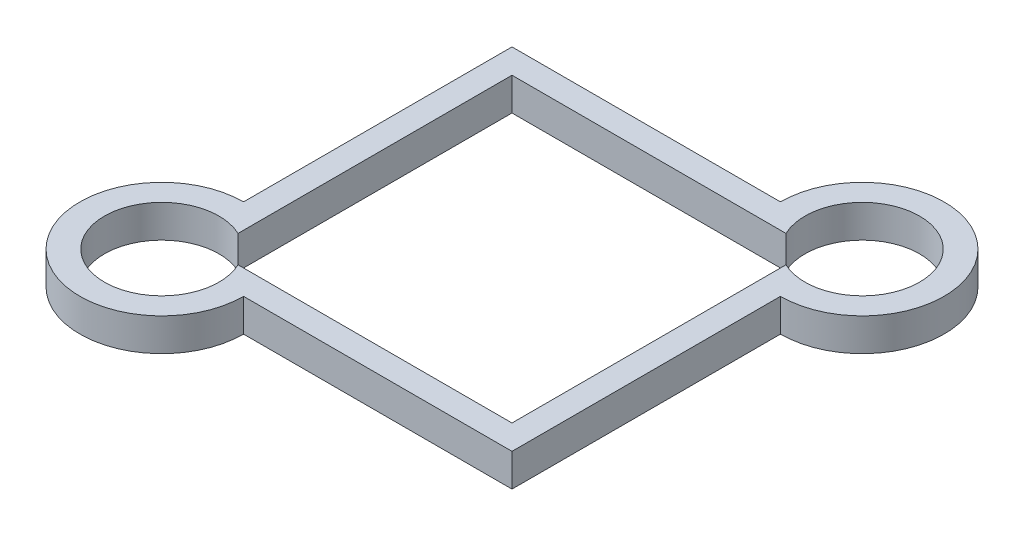
ISO-10303-21;
HEADER;
FILE_DESCRIPTION(('STEP AP214'),'2;1');
FILE_NAME('part.step','',(''),(''),'','','');
FILE_SCHEMA(('AUTOMOTIVE_DESIGN { 1 0 10303 214 1 1 1 1 }'));
ENDSEC;
DATA;
#1=APPLICATION_CONTEXT('core data for automotive mechanical design processes');
#2=APPLICATION_PROTOCOL_DEFINITION('international standard','automotive_design',2000,#1);
#3=PRODUCT_CONTEXT('',#1,'mechanical');
#4=PRODUCT('Part','Part','',(#3));
#5=PRODUCT_RELATED_PRODUCT_CATEGORY('part','',(#4));
#6=PRODUCT_DEFINITION_FORMATION('','',#4);
#7=PRODUCT_DEFINITION_CONTEXT('part definition',#1,'design');
#8=PRODUCT_DEFINITION('design','',#6,#7);
#9=PRODUCT_DEFINITION_SHAPE('','',#8);
#10=(LENGTH_UNIT() NAMED_UNIT(*) SI_UNIT(.MILLI.,.METRE.));
#11=(NAMED_UNIT(*) PLANE_ANGLE_UNIT() SI_UNIT($,.RADIAN.));
#12=(NAMED_UNIT(*) SI_UNIT($,.STERADIAN.) SOLID_ANGLE_UNIT());
#13=UNCERTAINTY_MEASURE_WITH_UNIT(LENGTH_MEASURE(1.E-05),#10,'distance_accuracy_value','');
#14=(GEOMETRIC_REPRESENTATION_CONTEXT(3) GLOBAL_UNCERTAINTY_ASSIGNED_CONTEXT((#13)) GLOBAL_UNIT_ASSIGNED_CONTEXT((#10,
#11,#12)) REPRESENTATION_CONTEXT('',''));
#15=CARTESIAN_POINT('',(0.,0.,0.));
#16=DIRECTION('',(0.,0.,1.));
#17=DIRECTION('',(1.,0.,0.));
#18=AXIS2_PLACEMENT_3D('',#15,#16,#17);
#19=CARTESIAN_POINT('',(0.,20.,0.));
#20=DIRECTION('',(0.,1.,0.));
#21=DIRECTION('',(0.,0.,1.));
#22=AXIS2_PLACEMENT_3D('',#19,#20,#21);
#23=PLANE('',#22);
#24=CARTESIAN_POINT('',(0.,20.,0.));
#25=DIRECTION('',(0.,1.,0.));
#26=DIRECTION('',(0.,0.,1.));
#27=AXIS2_PLACEMENT_3D('',#24,#25,#26);
#28=CIRCLE('',#27,50.);
#29=CARTESIAN_POINT('',(0.,20.,-50.));
#30=VERTEX_POINT('',#29);
#31=CARTESIAN_POINT('',(50.,20.,0.));
#32=VERTEX_POINT('',#31);
#33=EDGE_CURVE('E177',#30,#32,#28,.T.);
#34=ORIENTED_EDGE('',*,*,#33,.T.);
#35=DIRECTION('',(1.,0.,0.));
#36=VECTOR('',#35,1.);
#37=CARTESIAN_POINT('',(50.,20.,0.));
#38=LINE('',#37,#36);
#39=CARTESIAN_POINT('',(214.,20.,0.));
#40=VERTEX_POINT('',#39);
#41=EDGE_CURVE('E180',#32,#40,#38,.T.);
#42=ORIENTED_EDGE('',*,*,#41,.T.);
#43=DIRECTION('',(0.,0.,-1.));
#44=VECTOR('',#43,1.);
#45=CARTESIAN_POINT('',(214.,20.,0.));
#46=LINE('',#45,#44);
#47=CARTESIAN_POINT('',(214.,20.,-164.));
#48=VERTEX_POINT('',#47);
#49=EDGE_CURVE('E183',#40,#48,#46,.T.);
#50=ORIENTED_EDGE('',*,*,#49,.T.);
#51=CARTESIAN_POINT('',(214.,20.,-214.));
#52=DIRECTION('',(0.,1.,0.));
#53=DIRECTION('',(0.,0.,1.));
#54=AXIS2_PLACEMENT_3D('',#51,#52,#53);
#55=CIRCLE('',#54,50.);
#56=CARTESIAN_POINT('',(164.,20.,-214.));
#57=VERTEX_POINT('',#56);
#58=EDGE_CURVE('E185',#48,#57,#55,.T.);
#59=ORIENTED_EDGE('',*,*,#58,.T.);
#60=DIRECTION('',(-1.,0.,0.));
#61=VECTOR('',#60,1.);
#62=CARTESIAN_POINT('',(164.,20.,-214.));
#63=LINE('',#62,#61);
#64=CARTESIAN_POINT('',(0.,20.,-214.));
#65=VERTEX_POINT('',#64);
#66=EDGE_CURVE('E187',#57,#65,#63,.T.);
#67=ORIENTED_EDGE('',*,*,#66,.T.);
#68=DIRECTION('',(0.,0.,1.));
#69=VECTOR('',#68,1.);
#70=CARTESIAN_POINT('',(0.,20.,-214.));
#71=LINE('',#70,#69);
#72=EDGE_CURVE('E189',#65,#30,#71,.T.);
#73=ORIENTED_EDGE('',*,*,#72,.T.);
#74=EDGE_LOOP('',(#34,#42,#50,#59,#67,#73));
#75=FACE_BOUND('',#74,.T.);
#76=DIRECTION('',(1.,0.,0.));
#77=VECTOR('',#76,1.);
#78=CARTESIAN_POINT('',(31.6227766016838,20.,-15.));
#79=LINE('',#78,#77);
#80=CARTESIAN_POINT('',(31.6227766016838,20.,-15.));
#81=VERTEX_POINT('',#80);
#82=CARTESIAN_POINT('',(199.,20.,-15.));
#83=VERTEX_POINT('',#82);
#84=EDGE_CURVE('E134',#81,#83,#79,.T.);
#85=ORIENTED_EDGE('',*,*,#84,.F.);
#86=CARTESIAN_POINT('',(0.,20.,0.));
#87=DIRECTION('',(0.,1.,0.));
#88=DIRECTION('',(0.,0.,1.));
#89=AXIS2_PLACEMENT_3D('',#86,#87,#88);
#90=CIRCLE('',#89,35.);
#91=CARTESIAN_POINT('',(15.,20.,-31.6227766016838));
#92=VERTEX_POINT('',#91);
#93=EDGE_CURVE('E126',#92,#81,#90,.T.);
#94=ORIENTED_EDGE('',*,*,#93,.F.);
#95=DIRECTION('',(0.,0.,1.));
#96=VECTOR('',#95,1.);
#97=CARTESIAN_POINT('',(15.,20.,-199.));
#98=LINE('',#97,#96);
#99=CARTESIAN_POINT('',(15.,20.,-199.));
#100=VERTEX_POINT('',#99);
#101=EDGE_CURVE('E155',#100,#92,#98,.T.);
#102=ORIENTED_EDGE('',*,*,#101,.F.);
#103=DIRECTION('',(-1.,0.,0.));
#104=VECTOR('',#103,1.);
#105=CARTESIAN_POINT('',(182.377223398316,20.,-199.));
#106=LINE('',#105,#104);
#107=CARTESIAN_POINT('',(182.377223398316,20.,-199.));
#108=VERTEX_POINT('',#107);
#109=EDGE_CURVE('E153',#108,#100,#106,.T.);
#110=ORIENTED_EDGE('',*,*,#109,.F.);
#111=CARTESIAN_POINT('',(214.,20.,-214.));
#112=DIRECTION('',(0.,1.,0.));
#113=DIRECTION('',(0.,0.,1.));
#114=AXIS2_PLACEMENT_3D('',#111,#112,#113);
#115=CIRCLE('',#114,35.);
#116=CARTESIAN_POINT('',(199.,20.,-182.377223398316));
#117=VERTEX_POINT('',#116);
#118=EDGE_CURVE('E149',#117,#108,#115,.T.);
#119=ORIENTED_EDGE('',*,*,#118,.F.);
#120=DIRECTION('',(0.,0.,-1.));
#121=VECTOR('',#120,1.);
#122=CARTESIAN_POINT('',(199.,20.,-15.));
#123=LINE('',#122,#121);
#124=EDGE_CURVE('E147',#83,#117,#123,.T.);
#125=ORIENTED_EDGE('',*,*,#124,.F.);
#126=EDGE_LOOP('',(#85,#94,#102,#110,#119,#125));
#127=FACE_BOUND('',#126,.T.);
#128=ADVANCED_FACE('F37',(#75,#127),#23,.T.);
#129=CARTESIAN_POINT('',(0.,0.,0.));
#130=DIRECTION('',(0.,1.,0.));
#131=DIRECTION('',(0.,0.,1.));
#132=AXIS2_PLACEMENT_3D('',#129,#130,#131);
#133=PLANE('',#132);
#134=CARTESIAN_POINT('',(0.,0.,0.));
#135=DIRECTION('',(0.,1.,0.));
#136=DIRECTION('',(0.,0.,1.));
#137=AXIS2_PLACEMENT_3D('',#134,#135,#136);
#138=CIRCLE('',#137,50.);
#139=CARTESIAN_POINT('',(0.,0.,-50.));
#140=VERTEX_POINT('',#139);
#141=CARTESIAN_POINT('',(50.,0.,0.));
#142=VERTEX_POINT('',#141);
#143=EDGE_CURVE('E142',#140,#142,#138,.T.);
#144=ORIENTED_EDGE('',*,*,#143,.F.);
#145=DIRECTION('',(0.,0.,1.));
#146=VECTOR('',#145,1.);
#147=CARTESIAN_POINT('',(0.,0.,-214.));
#148=LINE('',#147,#146);
#149=CARTESIAN_POINT('',(0.,0.,-214.));
#150=VERTEX_POINT('',#149);
#151=EDGE_CURVE('E181',#150,#140,#148,.T.);
#152=ORIENTED_EDGE('',*,*,#151,.F.);
#153=DIRECTION('',(-1.,0.,0.));
#154=VECTOR('',#153,1.);
#155=CARTESIAN_POINT('',(164.,0.,-214.));
#156=LINE('',#155,#154);
#157=CARTESIAN_POINT('',(164.,0.,-214.));
#158=VERTEX_POINT('',#157);
#159=EDGE_CURVE('E200',#158,#150,#156,.T.);
#160=ORIENTED_EDGE('',*,*,#159,.F.);
#161=CARTESIAN_POINT('',(214.,0.,-214.));
#162=DIRECTION('',(0.,1.,0.));
#163=DIRECTION('',(0.,0.,1.));
#164=AXIS2_PLACEMENT_3D('',#161,#162,#163);
#165=CIRCLE('',#164,50.);
#166=CARTESIAN_POINT('',(214.,0.,-164.));
#167=VERTEX_POINT('',#166);
#168=EDGE_CURVE('E198',#167,#158,#165,.T.);
#169=ORIENTED_EDGE('',*,*,#168,.F.);
#170=DIRECTION('',(0.,0.,-1.));
#171=VECTOR('',#170,1.);
#172=CARTESIAN_POINT('',(214.,0.,0.));
#173=LINE('',#172,#171);
#174=CARTESIAN_POINT('',(214.,0.,0.));
#175=VERTEX_POINT('',#174);
#176=EDGE_CURVE('E196',#175,#167,#173,.T.);
#177=ORIENTED_EDGE('',*,*,#176,.F.);
#178=DIRECTION('',(1.,0.,0.));
#179=VECTOR('',#178,1.);
#180=CARTESIAN_POINT('',(50.,0.,0.));
#181=LINE('',#180,#179);
#182=EDGE_CURVE('E194',#142,#175,#181,.T.);
#183=ORIENTED_EDGE('',*,*,#182,.F.);
#184=EDGE_LOOP('',(#144,#152,#160,#169,#177,#183));
#185=FACE_BOUND('',#184,.T.);
#186=CARTESIAN_POINT('',(0.,0.,0.));
#187=DIRECTION('',(0.,1.,0.));
#188=DIRECTION('',(0.,0.,1.));
#189=AXIS2_PLACEMENT_3D('',#186,#187,#188);
#190=CIRCLE('',#189,35.);
#191=CARTESIAN_POINT('',(15.,0.,-31.6227766016838));
#192=VERTEX_POINT('',#191);
#193=CARTESIAN_POINT('',(31.6227766016838,0.,-15.));
#194=VERTEX_POINT('',#193);
#195=EDGE_CURVE('E60',#192,#194,#190,.T.);
#196=ORIENTED_EDGE('',*,*,#195,.T.);
#197=DIRECTION('',(1.,0.,0.));
#198=VECTOR('',#197,1.);
#199=CARTESIAN_POINT('',(31.6227766016838,0.,-15.));
#200=LINE('',#199,#198);
#201=CARTESIAN_POINT('',(199.,0.,-15.));
#202=VERTEX_POINT('',#201);
#203=EDGE_CURVE('E141',#194,#202,#200,.T.);
#204=ORIENTED_EDGE('',*,*,#203,.T.);
#205=DIRECTION('',(0.,0.,-1.));
#206=VECTOR('',#205,1.);
#207=CARTESIAN_POINT('',(199.,0.,-15.));
#208=LINE('',#207,#206);
#209=CARTESIAN_POINT('',(199.,0.,-182.377223398316));
#210=VERTEX_POINT('',#209);
#211=EDGE_CURVE('E159',#202,#210,#208,.T.);
#212=ORIENTED_EDGE('',*,*,#211,.T.);
#213=CARTESIAN_POINT('',(214.,0.,-214.));
#214=DIRECTION('',(0.,1.,0.));
#215=DIRECTION('',(0.,0.,1.));
#216=AXIS2_PLACEMENT_3D('',#213,#214,#215);
#217=CIRCLE('',#216,35.);
#218=CARTESIAN_POINT('',(182.377223398316,0.,-199.));
#219=VERTEX_POINT('',#218);
#220=EDGE_CURVE('E162',#210,#219,#217,.T.);
#221=ORIENTED_EDGE('',*,*,#220,.T.);
#222=DIRECTION('',(-1.,0.,0.));
#223=VECTOR('',#222,1.);
#224=CARTESIAN_POINT('',(182.377223398316,0.,-199.));
#225=LINE('',#224,#223);
#226=CARTESIAN_POINT('',(15.,0.,-199.));
#227=VERTEX_POINT('',#226);
#228=EDGE_CURVE('E165',#219,#227,#225,.T.);
#229=ORIENTED_EDGE('',*,*,#228,.T.);
#230=DIRECTION('',(0.,0.,1.));
#231=VECTOR('',#230,1.);
#232=CARTESIAN_POINT('',(15.,0.,-199.));
#233=LINE('',#232,#231);
#234=EDGE_CURVE('E135',#227,#192,#233,.T.);
#235=ORIENTED_EDGE('',*,*,#234,.T.);
#236=EDGE_LOOP('',(#196,#204,#212,#221,#229,#235));
#237=FACE_BOUND('',#236,.T.);
#238=ADVANCED_FACE('F224',(#185,#237),#133,.F.);
#239=CARTESIAN_POINT('',(0.,20.,0.));
#240=DIRECTION('',(0.,-1.,0.));
#241=DIRECTION('',(0.,0.,-1.));
#242=AXIS2_PLACEMENT_3D('',#239,#240,#241);
#243=CYLINDRICAL_SURFACE('',#242,50.);
#244=ORIENTED_EDGE('',*,*,#143,.T.);
#245=DIRECTION('',(0.,-1.,0.));
#246=VECTOR('',#245,1.);
#247=CARTESIAN_POINT('',(50.,20.,0.));
#248=LINE('',#247,#246);
#249=EDGE_CURVE('E11',#32,#142,#248,.T.);
#250=ORIENTED_EDGE('',*,*,#249,.F.);
#251=ORIENTED_EDGE('',*,*,#33,.F.);
#252=DIRECTION('',(0.,-1.,0.));
#253=VECTOR('',#252,1.);
#254=CARTESIAN_POINT('',(0.,20.,-50.));
#255=LINE('',#254,#253);
#256=EDGE_CURVE('E191',#30,#140,#255,.T.);
#257=ORIENTED_EDGE('',*,*,#256,.T.);
#258=EDGE_LOOP('',(#244,#250,#251,#257));
#259=FACE_BOUND('',#258,.T.);
#260=ADVANCED_FACE('F39',(#259),#243,.T.);
#261=CARTESIAN_POINT('',(50.,20.,0.));
#262=DIRECTION('',(0.,0.,-1.));
#263=DIRECTION('',(-1.,0.,0.));
#264=AXIS2_PLACEMENT_3D('',#261,#262,#263);
#265=PLANE('',#264);
#266=ORIENTED_EDGE('',*,*,#182,.T.);
#267=DIRECTION('',(0.,-1.,0.));
#268=VECTOR('',#267,1.);
#269=CARTESIAN_POINT('',(214.,20.,0.));
#270=LINE('',#269,#268);
#271=EDGE_CURVE('E45',#40,#175,#270,.T.);
#272=ORIENTED_EDGE('',*,*,#271,.F.);
#273=ORIENTED_EDGE('',*,*,#41,.F.);
#274=ORIENTED_EDGE('',*,*,#249,.T.);
#275=EDGE_LOOP('',(#266,#272,#273,#274));
#276=FACE_BOUND('',#275,.T.);
#277=ADVANCED_FACE('F241',(#276),#265,.F.);
#278=CARTESIAN_POINT('',(214.,20.,0.));
#279=DIRECTION('',(-1.,0.,0.));
#280=DIRECTION('',(0.,0.,1.));
#281=AXIS2_PLACEMENT_3D('',#278,#279,#280);
#282=PLANE('',#281);
#283=ORIENTED_EDGE('',*,*,#176,.T.);
#284=DIRECTION('',(0.,-1.,0.));
#285=VECTOR('',#284,1.);
#286=CARTESIAN_POINT('',(214.,20.,-164.));
#287=LINE('',#286,#285);
#288=EDGE_CURVE('E211',#48,#167,#287,.T.);
#289=ORIENTED_EDGE('',*,*,#288,.F.);
#290=ORIENTED_EDGE('',*,*,#49,.F.);
#291=ORIENTED_EDGE('',*,*,#271,.T.);
#292=EDGE_LOOP('',(#283,#289,#290,#291));
#293=FACE_BOUND('',#292,.T.);
#294=ADVANCED_FACE('F218',(#293),#282,.F.);
#295=CARTESIAN_POINT('',(214.,20.,-214.));
#296=DIRECTION('',(0.,-1.,0.));
#297=DIRECTION('',(0.,0.,-1.));
#298=AXIS2_PLACEMENT_3D('',#295,#296,#297);
#299=CYLINDRICAL_SURFACE('',#298,50.);
#300=ORIENTED_EDGE('',*,*,#168,.T.);
#301=DIRECTION('',(0.,-1.,0.));
#302=VECTOR('',#301,1.);
#303=CARTESIAN_POINT('',(164.,20.,-214.));
#304=LINE('',#303,#302);
#305=EDGE_CURVE('E208',#57,#158,#304,.T.);
#306=ORIENTED_EDGE('',*,*,#305,.F.);
#307=ORIENTED_EDGE('',*,*,#58,.F.);
#308=ORIENTED_EDGE('',*,*,#288,.T.);
#309=EDGE_LOOP('',(#300,#306,#307,#308));
#310=FACE_BOUND('',#309,.T.);
#311=ADVANCED_FACE('F230',(#310),#299,.T.);
#312=CARTESIAN_POINT('',(164.,20.,-214.));
#313=DIRECTION('',(0.,0.,1.));
#314=DIRECTION('',(1.,0.,0.));
#315=AXIS2_PLACEMENT_3D('',#312,#313,#314);
#316=PLANE('',#315);
#317=ORIENTED_EDGE('',*,*,#159,.T.);
#318=DIRECTION('',(0.,-1.,0.));
#319=VECTOR('',#318,1.);
#320=CARTESIAN_POINT('',(0.,20.,-214.));
#321=LINE('',#320,#319);
#322=EDGE_CURVE('E205',#65,#150,#321,.T.);
#323=ORIENTED_EDGE('',*,*,#322,.F.);
#324=ORIENTED_EDGE('',*,*,#66,.F.);
#325=ORIENTED_EDGE('',*,*,#305,.T.);
#326=EDGE_LOOP('',(#317,#323,#324,#325));
#327=FACE_BOUND('',#326,.T.);
#328=ADVANCED_FACE('F234',(#327),#316,.F.);
#329=CARTESIAN_POINT('',(0.,20.,-214.));
#330=DIRECTION('',(1.,0.,0.));
#331=DIRECTION('',(0.,0.,-1.));
#332=AXIS2_PLACEMENT_3D('',#329,#330,#331);
#333=PLANE('',#332);
#334=ORIENTED_EDGE('',*,*,#151,.T.);
#335=ORIENTED_EDGE('',*,*,#256,.F.);
#336=ORIENTED_EDGE('',*,*,#72,.F.);
#337=ORIENTED_EDGE('',*,*,#322,.T.);
#338=EDGE_LOOP('',(#334,#335,#336,#337));
#339=FACE_BOUND('',#338,.T.);
#340=ADVANCED_FACE('F244',(#339),#333,.F.);
#341=CARTESIAN_POINT('',(0.,20.,0.));
#342=DIRECTION('',(0.,-1.,0.));
#343=DIRECTION('',(0.,0.,-1.));
#344=AXIS2_PLACEMENT_3D('',#341,#342,#343);
#345=CYLINDRICAL_SURFACE('',#344,35.);
#346=ORIENTED_EDGE('',*,*,#195,.F.);
#347=DIRECTION('',(0.,-1.,0.));
#348=VECTOR('',#347,1.);
#349=CARTESIAN_POINT('',(15.,20.,-31.6227766016838));
#350=LINE('',#349,#348);
#351=EDGE_CURVE('E130',#92,#192,#350,.T.);
#352=ORIENTED_EDGE('',*,*,#351,.F.);
#353=ORIENTED_EDGE('',*,*,#93,.T.);
#354=DIRECTION('',(0.,-1.,0.));
#355=VECTOR('',#354,1.);
#356=CARTESIAN_POINT('',(31.6227766016838,20.,-15.));
#357=LINE('',#356,#355);
#358=EDGE_CURVE('E129',#81,#194,#357,.T.);
#359=ORIENTED_EDGE('',*,*,#358,.T.);
#360=EDGE_LOOP('',(#346,#352,#353,#359));
#361=FACE_BOUND('',#360,.T.);
#362=ADVANCED_FACE('F128',(#361),#345,.F.);
#363=CARTESIAN_POINT('',(31.6227766016838,20.,-15.));
#364=DIRECTION('',(0.,0.,-1.));
#365=DIRECTION('',(-1.,0.,0.));
#366=AXIS2_PLACEMENT_3D('',#363,#364,#365);
#367=PLANE('',#366);
#368=ORIENTED_EDGE('',*,*,#203,.F.);
#369=ORIENTED_EDGE('',*,*,#358,.F.);
#370=ORIENTED_EDGE('',*,*,#84,.T.);
#371=DIRECTION('',(0.,-1.,0.));
#372=VECTOR('',#371,1.);
#373=CARTESIAN_POINT('',(199.,20.,-15.));
#374=LINE('',#373,#372);
#375=EDGE_CURVE('E143',#83,#202,#374,.T.);
#376=ORIENTED_EDGE('',*,*,#375,.T.);
#377=EDGE_LOOP('',(#368,#369,#370,#376));
#378=FACE_BOUND('',#377,.T.);
#379=ADVANCED_FACE('F138',(#378),#367,.T.);
#380=CARTESIAN_POINT('',(199.,20.,-15.));
#381=DIRECTION('',(-1.,0.,0.));
#382=DIRECTION('',(0.,0.,1.));
#383=AXIS2_PLACEMENT_3D('',#380,#381,#382);
#384=PLANE('',#383);
#385=ORIENTED_EDGE('',*,*,#211,.F.);
#386=ORIENTED_EDGE('',*,*,#375,.F.);
#387=ORIENTED_EDGE('',*,*,#124,.T.);
#388=DIRECTION('',(0.,-1.,0.));
#389=VECTOR('',#388,1.);
#390=CARTESIAN_POINT('',(199.,20.,-182.377223398316));
#391=LINE('',#390,#389);
#392=EDGE_CURVE('E174',#117,#210,#391,.T.);
#393=ORIENTED_EDGE('',*,*,#392,.T.);
#394=EDGE_LOOP('',(#385,#386,#387,#393));
#395=FACE_BOUND('',#394,.T.);
#396=ADVANCED_FACE('F262',(#395),#384,.T.);
#397=CARTESIAN_POINT('',(214.,20.,-214.));
#398=DIRECTION('',(0.,-1.,0.));
#399=DIRECTION('',(0.,0.,-1.));
#400=AXIS2_PLACEMENT_3D('',#397,#398,#399);
#401=CYLINDRICAL_SURFACE('',#400,35.);
#402=ORIENTED_EDGE('',*,*,#220,.F.);
#403=ORIENTED_EDGE('',*,*,#392,.F.);
#404=ORIENTED_EDGE('',*,*,#118,.T.);
#405=DIRECTION('',(0.,-1.,0.));
#406=VECTOR('',#405,1.);
#407=CARTESIAN_POINT('',(182.377223398316,20.,-199.));
#408=LINE('',#407,#406);
#409=EDGE_CURVE('E172',#108,#219,#408,.T.);
#410=ORIENTED_EDGE('',*,*,#409,.T.);
#411=EDGE_LOOP('',(#402,#403,#404,#410));
#412=FACE_BOUND('',#411,.T.);
#413=ADVANCED_FACE('F265',(#412),#401,.F.);
#414=CARTESIAN_POINT('',(182.377223398316,20.,-199.));
#415=DIRECTION('',(0.,0.,1.));
#416=DIRECTION('',(1.,0.,0.));
#417=AXIS2_PLACEMENT_3D('',#414,#415,#416);
#418=PLANE('',#417);
#419=ORIENTED_EDGE('',*,*,#228,.F.);
#420=ORIENTED_EDGE('',*,*,#409,.F.);
#421=ORIENTED_EDGE('',*,*,#109,.T.);
#422=DIRECTION('',(0.,-1.,0.));
#423=VECTOR('',#422,1.);
#424=CARTESIAN_POINT('',(15.,20.,-199.));
#425=LINE('',#424,#423);
#426=EDGE_CURVE('E52',#100,#227,#425,.T.);
#427=ORIENTED_EDGE('',*,*,#426,.T.);
#428=EDGE_LOOP('',(#419,#420,#421,#427));
#429=FACE_BOUND('',#428,.T.);
#430=ADVANCED_FACE('F269',(#429),#418,.T.);
#431=CARTESIAN_POINT('',(15.,20.,-199.));
#432=DIRECTION('',(1.,0.,0.));
#433=DIRECTION('',(0.,0.,-1.));
#434=AXIS2_PLACEMENT_3D('',#431,#432,#433);
#435=PLANE('',#434);
#436=ORIENTED_EDGE('',*,*,#234,.F.);
#437=ORIENTED_EDGE('',*,*,#426,.F.);
#438=ORIENTED_EDGE('',*,*,#101,.T.);
#439=ORIENTED_EDGE('',*,*,#351,.T.);
#440=EDGE_LOOP('',(#436,#437,#438,#439));
#441=FACE_BOUND('',#440,.T.);
#442=ADVANCED_FACE('F273',(#441),#435,.T.);
#443=CLOSED_SHELL('',(#128,#238,#260,#277,#294,#311,#328,#340,#362,#379,#396,#413,#430,#442));
#444=MANIFOLD_SOLID_BREP('B2',#443);
#445=ADVANCED_BREP_SHAPE_REPRESENTATION('',(#18,#444),#14);
#446=SHAPE_DEFINITION_REPRESENTATION(#9,#445);
ENDSEC;
END-ISO-10303-21;
